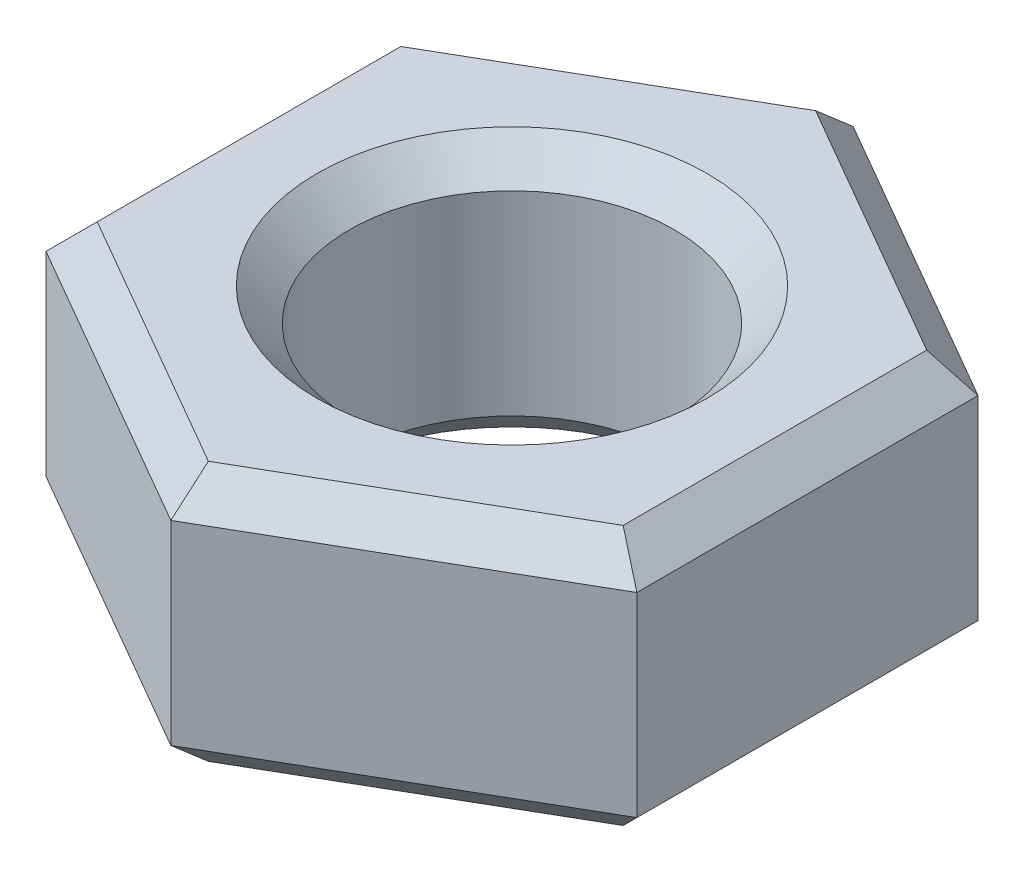
ISO-10303-21;
HEADER;
FILE_DESCRIPTION(('STEP AP214'),'2;1');
FILE_NAME('part.step','',(''),(''),'','','');
FILE_SCHEMA(('AUTOMOTIVE_DESIGN { 1 0 10303 214 1 1 1 1 }'));
ENDSEC;
DATA;
#1=APPLICATION_CONTEXT('core data for automotive mechanical design processes');
#2=APPLICATION_PROTOCOL_DEFINITION('international standard','automotive_design',2000,#1);
#3=PRODUCT_CONTEXT('',#1,'mechanical');
#4=PRODUCT('Part','Part','',(#3));
#5=PRODUCT_RELATED_PRODUCT_CATEGORY('part','',(#4));
#6=PRODUCT_DEFINITION_FORMATION('','',#4);
#7=PRODUCT_DEFINITION_CONTEXT('part definition',#1,'design');
#8=PRODUCT_DEFINITION('design','',#6,#7);
#9=PRODUCT_DEFINITION_SHAPE('','',#8);
#10=(LENGTH_UNIT() NAMED_UNIT(*) SI_UNIT(.MILLI.,.METRE.));
#11=(NAMED_UNIT(*) PLANE_ANGLE_UNIT() SI_UNIT($,.RADIAN.));
#12=(NAMED_UNIT(*) SI_UNIT($,.STERADIAN.) SOLID_ANGLE_UNIT());
#13=UNCERTAINTY_MEASURE_WITH_UNIT(LENGTH_MEASURE(1.E-05),#10,'distance_accuracy_value','');
#14=(GEOMETRIC_REPRESENTATION_CONTEXT(3) GLOBAL_UNCERTAINTY_ASSIGNED_CONTEXT((#13)) GLOBAL_UNIT_ASSIGNED_CONTEXT((#10,
#11,#12)) REPRESENTATION_CONTEXT('',''));
#15=CARTESIAN_POINT('',(0.,0.,0.));
#16=DIRECTION('',(0.,0.,1.));
#17=DIRECTION('',(1.,0.,0.));
#18=AXIS2_PLACEMENT_3D('',#15,#16,#17);
#19=CARTESIAN_POINT('',(0.,2.4,0.));
#20=DIRECTION('',(0.,1.,0.));
#21=DIRECTION('',(0.,0.,1.));
#22=AXIS2_PLACEMENT_3D('',#19,#20,#21);
#23=PLANE('',#22);
#24=CARTESIAN_POINT('',(0.,2.4,0.));
#25=DIRECTION('',(0.,1.,0.));
#26=DIRECTION('',(0.,0.,1.));
#27=AXIS2_PLACEMENT_3D('',#24,#25,#26);
#28=CIRCLE('',#27,1.8);
#29=CARTESIAN_POINT('',(0.,2.4,1.8));
#30=VERTEX_POINT('',#29);
#31=EDGE_CURVE('E158',#30,#30,#28,.F.);
#32=ORIENTED_EDGE('',*,*,#31,.T.);
#33=EDGE_LOOP('',(#32));
#34=FACE_BOUND('',#33,.T.);
#35=DIRECTION('',(0.866025403784439,0.,-0.5));
#36=VECTOR('',#35,1.);
#37=CARTESIAN_POINT('',(2.57798002192098,2.4,1.31519237886467));
#38=LINE('',#37,#36);
#39=CARTESIAN_POINT('',(0.,2.4,2.80358983848622));
#40=VERTEX_POINT('',#39);
#41=CARTESIAN_POINT('',(2.42798002192098,2.4,1.40179491924311));
#42=VERTEX_POINT('',#41);
#43=EDGE_CURVE('E156',#40,#42,#38,.T.);
#44=ORIENTED_EDGE('',*,*,#43,.T.);
#45=DIRECTION('',(0.,0.,-1.));
#46=VECTOR('',#45,1.);
#47=CARTESIAN_POINT('',(2.42798002192098,2.4,-1.575));
#48=LINE('',#47,#46);
#49=CARTESIAN_POINT('',(2.42798002192098,2.4,-1.40179491924311));
#50=VERTEX_POINT('',#49);
#51=EDGE_CURVE('E138',#42,#50,#48,.T.);
#52=ORIENTED_EDGE('',*,*,#51,.T.);
#53=DIRECTION('',(-0.866025403784439,0.,-0.5));
#54=VECTOR('',#53,1.);
#55=CARTESIAN_POINT('',(-0.150000000000001,2.4,-2.89019237886467));
#56=LINE('',#55,#54);
#57=CARTESIAN_POINT('',(0.,2.4,-2.80358983848622));
#58=VERTEX_POINT('',#57);
#59=EDGE_CURVE('E146',#50,#58,#56,.T.);
#60=ORIENTED_EDGE('',*,*,#59,.T.);
#61=DIRECTION('',(-0.866025403784439,0.,0.5));
#62=VECTOR('',#61,1.);
#63=CARTESIAN_POINT('',(-2.57798002192098,2.4,-1.31519237886467));
#64=LINE('',#63,#62);
#65=CARTESIAN_POINT('',(-2.42798002192098,2.4,-1.40179491924311));
#66=VERTEX_POINT('',#65);
#67=EDGE_CURVE('E152',#58,#66,#64,.T.);
#68=ORIENTED_EDGE('',*,*,#67,.T.);
#69=DIRECTION('',(0.,0.,1.));
#70=VECTOR('',#69,1.);
#71=CARTESIAN_POINT('',(-2.42798002192098,2.4,1.575));
#72=LINE('',#71,#70);
#73=CARTESIAN_POINT('',(-2.42798002192098,2.4,1.40179491924311));
#74=VERTEX_POINT('',#73);
#75=EDGE_CURVE('E271',#66,#74,#72,.T.);
#76=ORIENTED_EDGE('',*,*,#75,.T.);
#77=DIRECTION('',(0.866025403784439,0.,0.5));
#78=VECTOR('',#77,1.);
#79=CARTESIAN_POINT('',(0.15,2.4,2.89019237886467));
#80=LINE('',#79,#78);
#81=EDGE_CURVE('E163',#74,#40,#80,.T.);
#82=ORIENTED_EDGE('',*,*,#81,.T.);
#83=EDGE_LOOP('',(#44,#52,#60,#68,#76,#82));
#84=FACE_BOUND('',#83,.T.);
#85=ADVANCED_FACE('F40',(#34,#84),#23,.T.);
#86=CARTESIAN_POINT('',(0.,0.,0.));
#87=DIRECTION('',(0.,1.,0.));
#88=DIRECTION('',(0.,0.,1.));
#89=AXIS2_PLACEMENT_3D('',#86,#87,#88);
#90=PLANE('',#89);
#91=CARTESIAN_POINT('',(0.,0.,0.));
#92=DIRECTION('',(0.,1.,0.));
#93=DIRECTION('',(0.,0.,1.));
#94=AXIS2_PLACEMENT_3D('',#91,#92,#93);
#95=CIRCLE('',#94,1.8);
#96=CARTESIAN_POINT('',(0.,0.,1.8));
#97=VERTEX_POINT('',#96);
#98=EDGE_CURVE('E11',#97,#97,#95,.T.);
#99=ORIENTED_EDGE('',*,*,#98,.T.);
#100=EDGE_LOOP('',(#99));
#101=FACE_BOUND('',#100,.T.);
#102=DIRECTION('',(0.,0.,-1.));
#103=VECTOR('',#102,1.);
#104=CARTESIAN_POINT('',(-2.42798002192098,0.,0.));
#105=LINE('',#104,#103);
#106=CARTESIAN_POINT('',(-2.42798002192098,0.,1.40179491924311));
#107=VERTEX_POINT('',#106);
#108=CARTESIAN_POINT('',(-2.42798002192098,0.,-1.40179491924311));
#109=VERTEX_POINT('',#108);
#110=EDGE_CURVE('E59',#107,#109,#105,.T.);
#111=ORIENTED_EDGE('',*,*,#110,.T.);
#112=DIRECTION('',(0.866025403784439,0.,-0.5));
#113=VECTOR('',#112,1.);
#114=CARTESIAN_POINT('',(-1.21399001096049,0.,-2.10269237886467));
#115=LINE('',#114,#113);
#116=CARTESIAN_POINT('',(0.,0.,-2.80358983848622));
#117=VERTEX_POINT('',#116);
#118=EDGE_CURVE('E51',#109,#117,#115,.T.);
#119=ORIENTED_EDGE('',*,*,#118,.T.);
#120=DIRECTION('',(0.866025403784439,0.,0.5));
#121=VECTOR('',#120,1.);
#122=CARTESIAN_POINT('',(1.21399001096049,0.,-2.10269237886467));
#123=LINE('',#122,#121);
#124=CARTESIAN_POINT('',(2.42798002192098,0.,-1.40179491924311));
#125=VERTEX_POINT('',#124);
#126=EDGE_CURVE('E191',#117,#125,#123,.T.);
#127=ORIENTED_EDGE('',*,*,#126,.T.);
#128=DIRECTION('',(0.,0.,1.));
#129=VECTOR('',#128,1.);
#130=CARTESIAN_POINT('',(2.42798002192098,0.,0.));
#131=LINE('',#130,#129);
#132=CARTESIAN_POINT('',(2.42798002192098,0.,1.40179491924311));
#133=VERTEX_POINT('',#132);
#134=EDGE_CURVE('E193',#125,#133,#131,.T.);
#135=ORIENTED_EDGE('',*,*,#134,.T.);
#136=DIRECTION('',(-0.866025403784439,0.,0.5));
#137=VECTOR('',#136,1.);
#138=CARTESIAN_POINT('',(1.21399001096049,0.,2.10269237886467));
#139=LINE('',#138,#137);
#140=CARTESIAN_POINT('',(0.,0.,2.80358983848622));
#141=VERTEX_POINT('',#140);
#142=EDGE_CURVE('E196',#133,#141,#139,.T.);
#143=ORIENTED_EDGE('',*,*,#142,.T.);
#144=DIRECTION('',(-0.866025403784439,0.,-0.5));
#145=VECTOR('',#144,1.);
#146=CARTESIAN_POINT('',(-1.21399001096049,0.,2.10269237886467));
#147=LINE('',#146,#145);
#148=EDGE_CURVE('E64',#141,#107,#147,.T.);
#149=ORIENTED_EDGE('',*,*,#148,.T.);
#150=EDGE_LOOP('',(#111,#119,#127,#135,#143,#149));
#151=FACE_BOUND('',#150,.T.);
#152=ADVANCED_FACE('F239',(#101,#151),#90,.F.);
#153=CARTESIAN_POINT('',(2.72798002192098,2.4,-1.575));
#154=DIRECTION('',(-0.5,0.,0.866025403784439));
#155=DIRECTION('',(0.866025403784439,0.,0.5));
#156=AXIS2_PLACEMENT_3D('',#153,#154,#155);
#157=PLANE('',#156);
#158=DIRECTION('',(0.,-1.,0.));
#159=VECTOR('',#158,1.);
#160=CARTESIAN_POINT('',(0.,2.4,-3.15));
#161=LINE('',#160,#159);
#162=CARTESIAN_POINT('',(0.,2.1,-3.15));
#163=VERTEX_POINT('',#162);
#164=CARTESIAN_POINT('',(0.,0.3,-3.15));
#165=VERTEX_POINT('',#164);
#166=EDGE_CURVE('E251',#163,#165,#161,.T.);
#167=ORIENTED_EDGE('',*,*,#166,.F.);
#168=DIRECTION('',(0.866025403784439,0.,0.5));
#169=VECTOR('',#168,1.);
#170=CARTESIAN_POINT('',(2.72798002192098,2.1,-1.575));
#171=LINE('',#170,#169);
#172=CARTESIAN_POINT('',(2.72798002192098,2.1,-1.575));
#173=VERTEX_POINT('',#172);
#174=EDGE_CURVE('E189',#163,#173,#171,.T.);
#175=ORIENTED_EDGE('',*,*,#174,.T.);
#176=DIRECTION('',(0.,-1.,0.));
#177=VECTOR('',#176,1.);
#178=CARTESIAN_POINT('',(2.72798002192098,2.4,-1.575));
#179=LINE('',#178,#177);
#180=CARTESIAN_POINT('',(2.72798002192098,0.3,-1.575));
#181=VERTEX_POINT('',#180);
#182=EDGE_CURVE('E213',#173,#181,#179,.T.);
#183=ORIENTED_EDGE('',*,*,#182,.T.);
#184=DIRECTION('',(-0.866025403784439,0.,-0.5));
#185=VECTOR('',#184,1.);
#186=CARTESIAN_POINT('',(2.72798002192098,0.3,-1.575));
#187=LINE('',#186,#185);
#188=EDGE_CURVE('E187',#181,#165,#187,.T.);
#189=ORIENTED_EDGE('',*,*,#188,.T.);
#190=EDGE_LOOP('',(#167,#175,#183,#189));
#191=FACE_BOUND('',#190,.T.);
#192=ADVANCED_FACE('F250',(#191),#157,.F.);
#193=CARTESIAN_POINT('',(0.,2.4,-3.15));
#194=DIRECTION('',(0.5,0.,0.866025403784439));
#195=DIRECTION('',(0.866025403784439,0.,-0.5));
#196=AXIS2_PLACEMENT_3D('',#193,#194,#195);
#197=PLANE('',#196);
#198=DIRECTION('',(0.,-1.,0.));
#199=VECTOR('',#198,1.);
#200=CARTESIAN_POINT('',(-2.72798002192098,2.4,-1.575));
#201=LINE('',#200,#199);
#202=CARTESIAN_POINT('',(-2.72798002192098,2.1,-1.575));
#203=VERTEX_POINT('',#202);
#204=CARTESIAN_POINT('',(-2.72798002192098,0.3,-1.575));
#205=VERTEX_POINT('',#204);
#206=EDGE_CURVE('E259',#203,#205,#201,.T.);
#207=ORIENTED_EDGE('',*,*,#206,.F.);
#208=DIRECTION('',(0.866025403784439,0.,-0.5));
#209=VECTOR('',#208,1.);
#210=CARTESIAN_POINT('',(0.,2.1,-3.15));
#211=LINE('',#210,#209);
#212=EDGE_CURVE('E185',#203,#163,#211,.T.);
#213=ORIENTED_EDGE('',*,*,#212,.T.);
#214=ORIENTED_EDGE('',*,*,#166,.T.);
#215=DIRECTION('',(-0.866025403784439,0.,0.5));
#216=VECTOR('',#215,1.);
#217=CARTESIAN_POINT('',(0.,0.3,-3.15));
#218=LINE('',#217,#216);
#219=EDGE_CURVE('E181',#165,#205,#218,.T.);
#220=ORIENTED_EDGE('',*,*,#219,.T.);
#221=EDGE_LOOP('',(#207,#213,#214,#220));
#222=FACE_BOUND('',#221,.T.);
#223=ADVANCED_FACE('F255',(#222),#197,.F.);
#224=CARTESIAN_POINT('',(-2.72798002192098,2.4,-1.575));
#225=DIRECTION('',(1.,0.,0.));
#226=DIRECTION('',(0.,0.,-1.));
#227=AXIS2_PLACEMENT_3D('',#224,#225,#226);
#228=PLANE('',#227);
#229=DIRECTION('',(0.,-1.,0.));
#230=VECTOR('',#229,1.);
#231=CARTESIAN_POINT('',(-2.72798002192098,2.4,1.575));
#232=LINE('',#231,#230);
#233=CARTESIAN_POINT('',(-2.72798002192098,2.1,1.575));
#234=VERTEX_POINT('',#233);
#235=CARTESIAN_POINT('',(-2.72798002192098,0.3,1.575));
#236=VERTEX_POINT('',#235);
#237=EDGE_CURVE('E264',#234,#236,#232,.T.);
#238=ORIENTED_EDGE('',*,*,#237,.F.);
#239=DIRECTION('',(0.,0.,-1.));
#240=VECTOR('',#239,1.);
#241=CARTESIAN_POINT('',(-2.72798002192098,2.1,-1.575));
#242=LINE('',#241,#240);
#243=EDGE_CURVE('E179',#234,#203,#242,.T.);
#244=ORIENTED_EDGE('',*,*,#243,.T.);
#245=ORIENTED_EDGE('',*,*,#206,.T.);
#246=DIRECTION('',(0.,0.,1.));
#247=VECTOR('',#246,1.);
#248=CARTESIAN_POINT('',(-2.72798002192098,0.3,-1.575));
#249=LINE('',#248,#247);
#250=EDGE_CURVE('E177',#205,#236,#249,.T.);
#251=ORIENTED_EDGE('',*,*,#250,.T.);
#252=EDGE_LOOP('',(#238,#244,#245,#251));
#253=FACE_BOUND('',#252,.T.);
#254=ADVANCED_FACE('F333',(#253),#228,.F.);
#255=CARTESIAN_POINT('',(-2.72798002192098,2.4,1.575));
#256=DIRECTION('',(0.5,0.,-0.866025403784439));
#257=DIRECTION('',(-0.866025403784439,0.,-0.5));
#258=AXIS2_PLACEMENT_3D('',#255,#256,#257);
#259=PLANE('',#258);
#260=DIRECTION('',(0.,-1.,0.));
#261=VECTOR('',#260,1.);
#262=CARTESIAN_POINT('',(0.,2.4,3.15));
#263=LINE('',#262,#261);
#264=CARTESIAN_POINT('',(0.,2.1,3.15));
#265=VERTEX_POINT('',#264);
#266=CARTESIAN_POINT('',(0.,0.3,3.15));
#267=VERTEX_POINT('',#266);
#268=EDGE_CURVE('E291',#265,#267,#263,.T.);
#269=ORIENTED_EDGE('',*,*,#268,.F.);
#270=DIRECTION('',(-0.866025403784439,0.,-0.5));
#271=VECTOR('',#270,1.);
#272=CARTESIAN_POINT('',(-2.72798002192098,2.1,1.575));
#273=LINE('',#272,#271);
#274=EDGE_CURVE('E175',#265,#234,#273,.T.);
#275=ORIENTED_EDGE('',*,*,#274,.T.);
#276=ORIENTED_EDGE('',*,*,#237,.T.);
#277=DIRECTION('',(0.866025403784439,0.,0.5));
#278=VECTOR('',#277,1.);
#279=CARTESIAN_POINT('',(-2.72798002192098,0.3,1.575));
#280=LINE('',#279,#278);
#281=EDGE_CURVE('E173',#236,#267,#280,.T.);
#282=ORIENTED_EDGE('',*,*,#281,.T.);
#283=EDGE_LOOP('',(#269,#275,#276,#282));
#284=FACE_BOUND('',#283,.T.);
#285=ADVANCED_FACE('F298',(#284),#259,.F.);
#286=CARTESIAN_POINT('',(0.,2.4,3.15));
#287=DIRECTION('',(-0.5,0.,-0.866025403784439));
#288=DIRECTION('',(-0.866025403784439,0.,0.5));
#289=AXIS2_PLACEMENT_3D('',#286,#287,#288);
#290=PLANE('',#289);
#291=DIRECTION('',(0.,-1.,0.));
#292=VECTOR('',#291,1.);
#293=CARTESIAN_POINT('',(2.72798002192098,2.4,1.575));
#294=LINE('',#293,#292);
#295=CARTESIAN_POINT('',(2.72798002192098,2.1,1.575));
#296=VERTEX_POINT('',#295);
#297=CARTESIAN_POINT('',(2.72798002192098,0.3,1.575));
#298=VERTEX_POINT('',#297);
#299=EDGE_CURVE('E289',#296,#298,#294,.T.);
#300=ORIENTED_EDGE('',*,*,#299,.F.);
#301=DIRECTION('',(-0.866025403784439,0.,0.5));
#302=VECTOR('',#301,1.);
#303=CARTESIAN_POINT('',(0.,2.1,3.15));
#304=LINE('',#303,#302);
#305=EDGE_CURVE('E171',#296,#265,#304,.T.);
#306=ORIENTED_EDGE('',*,*,#305,.T.);
#307=ORIENTED_EDGE('',*,*,#268,.T.);
#308=DIRECTION('',(0.866025403784439,0.,-0.5));
#309=VECTOR('',#308,1.);
#310=CARTESIAN_POINT('',(0.,0.3,3.15));
#311=LINE('',#310,#309);
#312=EDGE_CURVE('E169',#267,#298,#311,.T.);
#313=ORIENTED_EDGE('',*,*,#312,.T.);
#314=EDGE_LOOP('',(#300,#306,#307,#313));
#315=FACE_BOUND('',#314,.T.);
#316=ADVANCED_FACE('F290',(#315),#290,.F.);
#317=CARTESIAN_POINT('',(2.72798002192098,2.4,1.575));
#318=DIRECTION('',(-1.,0.,0.));
#319=DIRECTION('',(0.,0.,1.));
#320=AXIS2_PLACEMENT_3D('',#317,#318,#319);
#321=PLANE('',#320);
#322=ORIENTED_EDGE('',*,*,#182,.F.);
#323=DIRECTION('',(0.,0.,1.));
#324=VECTOR('',#323,1.);
#325=CARTESIAN_POINT('',(2.72798002192098,2.1,1.575));
#326=LINE('',#325,#324);
#327=EDGE_CURVE('E140',#173,#296,#326,.T.);
#328=ORIENTED_EDGE('',*,*,#327,.T.);
#329=ORIENTED_EDGE('',*,*,#299,.T.);
#330=DIRECTION('',(0.,0.,-1.));
#331=VECTOR('',#330,1.);
#332=CARTESIAN_POINT('',(2.72798002192098,0.3,1.575));
#333=LINE('',#332,#331);
#334=EDGE_CURVE('E161',#298,#181,#333,.T.);
#335=ORIENTED_EDGE('',*,*,#334,.T.);
#336=EDGE_LOOP('',(#322,#328,#329,#335));
#337=FACE_BOUND('',#336,.T.);
#338=ADVANCED_FACE('F288',(#337),#321,.F.);
#339=CARTESIAN_POINT('',(0.,2.4,0.));
#340=DIRECTION('',(0.,-1.,0.));
#341=DIRECTION('',(0.,0.,-1.));
#342=AXIS2_PLACEMENT_3D('',#339,#340,#341);
#343=CYLINDRICAL_SURFACE('',#342,1.5);
#344=CARTESIAN_POINT('',(0.,2.1,0.));
#345=DIRECTION('',(0.,1.,0.));
#346=DIRECTION('',(0.,0.,1.));
#347=AXIS2_PLACEMENT_3D('',#344,#345,#346);
#348=CIRCLE('',#347,1.5);
#349=CARTESIAN_POINT('',(0.,2.1,1.5));
#350=VERTEX_POINT('',#349);
#351=EDGE_CURVE('E153',#350,#350,#348,.T.);
#352=ORIENTED_EDGE('',*,*,#351,.T.);
#353=EDGE_LOOP('',(#352));
#354=FACE_BOUND('',#353,.T.);
#355=CARTESIAN_POINT('',(0.,0.3,0.));
#356=DIRECTION('',(0.,1.,0.));
#357=DIRECTION('',(0.,0.,1.));
#358=AXIS2_PLACEMENT_3D('',#355,#356,#357);
#359=CIRCLE('',#358,1.5);
#360=CARTESIAN_POINT('',(0.,0.3,1.5));
#361=VERTEX_POINT('',#360);
#362=EDGE_CURVE('E258',#361,#361,#359,.F.);
#363=ORIENTED_EDGE('',*,*,#362,.T.);
#364=EDGE_LOOP('',(#363));
#365=FACE_BOUND('',#364,.T.);
#366=ADVANCED_FACE('F325',(#354,#365),#343,.F.);
#367=CARTESIAN_POINT('',(0.,2.1,0.));
#368=DIRECTION('',(0.,1.,0.));
#369=DIRECTION('',(0.,0.,1.));
#370=AXIS2_PLACEMENT_3D('',#367,#368,#369);
#371=CONICAL_SURFACE('',#370,1.5,0.785398163397447);
#372=ORIENTED_EDGE('',*,*,#31,.F.);
#373=EDGE_LOOP('',(#372));
#374=FACE_BOUND('',#373,.T.);
#375=ORIENTED_EDGE('',*,*,#351,.F.);
#376=EDGE_LOOP('',(#375));
#377=FACE_BOUND('',#376,.T.);
#378=ADVANCED_FACE('F341',(#374,#377),#371,.F.);
#379=CARTESIAN_POINT('',(-2.42798002192098,2.4,0.));
#380=DIRECTION('',(-0.707106781186548,0.707106781186547,0.));
#381=DIRECTION('',(0.,0.,-1.));
#382=AXIS2_PLACEMENT_3D('',#379,#380,#381);
#383=PLANE('',#382);
#384=DIRECTION('',(0.654653670707977,0.654653670707978,0.377964473009227));
#385=VECTOR('',#384,1.);
#386=CARTESIAN_POINT('',(-2.08112573307513,2.74685428884585,-1.20153850220838));
#387=LINE('',#386,#385);
#388=EDGE_CURVE('E207',#203,#66,#387,.T.);
#389=ORIENTED_EDGE('',*,*,#388,.F.);
#390=ORIENTED_EDGE('',*,*,#243,.F.);
#391=DIRECTION('',(0.654653670707977,0.654653670707978,-0.377964473009226));
#392=VECTOR('',#391,1.);
#393=CARTESIAN_POINT('',(-2.08112573307513,2.74685428884585,1.20153850220838));
#394=LINE('',#393,#392);
#395=EDGE_CURVE('E210',#74,#234,#394,.F.);
#396=ORIENTED_EDGE('',*,*,#395,.F.);
#397=ORIENTED_EDGE('',*,*,#75,.F.);
#398=EDGE_LOOP('',(#389,#390,#396,#397));
#399=FACE_BOUND('',#398,.T.);
#400=ADVANCED_FACE('F347',(#399),#383,.T.);
#401=CARTESIAN_POINT('',(-1.21399001096049,2.4,2.10269237886467));
#402=DIRECTION('',(-0.353553390593274,0.707106781186546,0.612372435695796));
#403=DIRECTION('',(-0.866025403784439,0.,-0.5));
#404=AXIS2_PLACEMENT_3D('',#401,#402,#403);
#405=PLANE('',#404);
#406=ORIENTED_EDGE('',*,*,#395,.T.);
#407=ORIENTED_EDGE('',*,*,#274,.F.);
#408=DIRECTION('',(0.,0.654653670707978,-0.755928946018453));
#409=VECTOR('',#408,1.);
#410=CARTESIAN_POINT('',(0.,2.74685428884586,2.40307700441676));
#411=LINE('',#410,#409);
#412=EDGE_CURVE('E204',#40,#265,#411,.F.);
#413=ORIENTED_EDGE('',*,*,#412,.F.);
#414=ORIENTED_EDGE('',*,*,#81,.F.);
#415=EDGE_LOOP('',(#406,#407,#413,#414));
#416=FACE_BOUND('',#415,.T.);
#417=ADVANCED_FACE('F278',(#416),#405,.T.);
#418=CARTESIAN_POINT('',(-1.21399001096049,2.4,-2.10269237886467));
#419=DIRECTION('',(-0.353553390593274,0.707106781186547,-0.612372435695795));
#420=DIRECTION('',(0.866025403784439,0.,-0.5));
#421=AXIS2_PLACEMENT_3D('',#418,#419,#420);
#422=PLANE('',#421);
#423=ORIENTED_EDGE('',*,*,#388,.T.);
#424=ORIENTED_EDGE('',*,*,#67,.F.);
#425=DIRECTION('',(0.,0.654653670707978,0.755928946018453));
#426=VECTOR('',#425,1.);
#427=CARTESIAN_POINT('',(0.,2.74685428884585,-2.40307700441676));
#428=LINE('',#427,#426);
#429=EDGE_CURVE('E149',#163,#58,#428,.T.);
#430=ORIENTED_EDGE('',*,*,#429,.F.);
#431=ORIENTED_EDGE('',*,*,#212,.F.);
#432=EDGE_LOOP('',(#423,#424,#430,#431));
#433=FACE_BOUND('',#432,.T.);
#434=ADVANCED_FACE('F367',(#433),#422,.T.);
#435=CARTESIAN_POINT('',(1.21399001096049,2.4,2.10269237886467));
#436=DIRECTION('',(0.353553390593274,0.707106781186547,0.612372435695795));
#437=DIRECTION('',(-0.866025403784439,0.,0.5));
#438=AXIS2_PLACEMENT_3D('',#435,#436,#437);
#439=PLANE('',#438);
#440=ORIENTED_EDGE('',*,*,#412,.T.);
#441=ORIENTED_EDGE('',*,*,#305,.F.);
#442=DIRECTION('',(-0.654653670707977,0.654653670707978,-0.377964473009227));
#443=VECTOR('',#442,1.);
#444=CARTESIAN_POINT('',(2.08112573307513,2.74685428884585,1.20153850220838));
#445=LINE('',#444,#443);
#446=EDGE_CURVE('E143',#42,#296,#445,.F.);
#447=ORIENTED_EDGE('',*,*,#446,.F.);
#448=ORIENTED_EDGE('',*,*,#43,.F.);
#449=EDGE_LOOP('',(#440,#441,#447,#448));
#450=FACE_BOUND('',#449,.T.);
#451=ADVANCED_FACE('F281',(#450),#439,.T.);
#452=CARTESIAN_POINT('',(1.21399001096049,2.4,-2.10269237886467));
#453=DIRECTION('',(0.353553390593274,0.707106781186546,-0.612372435695796));
#454=DIRECTION('',(0.866025403784439,0.,0.5));
#455=AXIS2_PLACEMENT_3D('',#452,#453,#454);
#456=PLANE('',#455);
#457=ORIENTED_EDGE('',*,*,#429,.T.);
#458=ORIENTED_EDGE('',*,*,#59,.F.);
#459=DIRECTION('',(0.654653670707977,-0.654653670707978,-0.377964473009226));
#460=VECTOR('',#459,1.);
#461=CARTESIAN_POINT('',(2.08112573307513,2.74685428884586,-1.20153850220838));
#462=LINE('',#461,#460);
#463=EDGE_CURVE('E134',#173,#50,#462,.F.);
#464=ORIENTED_EDGE('',*,*,#463,.F.);
#465=ORIENTED_EDGE('',*,*,#174,.F.);
#466=EDGE_LOOP('',(#457,#458,#464,#465));
#467=FACE_BOUND('',#466,.T.);
#468=ADVANCED_FACE('F147',(#467),#456,.T.);
#469=CARTESIAN_POINT('',(2.42798002192098,2.4,0.));
#470=DIRECTION('',(0.707106781186548,0.707106781186547,0.));
#471=DIRECTION('',(0.,0.,1.));
#472=AXIS2_PLACEMENT_3D('',#469,#470,#471);
#473=PLANE('',#472);
#474=ORIENTED_EDGE('',*,*,#446,.T.);
#475=ORIENTED_EDGE('',*,*,#327,.F.);
#476=ORIENTED_EDGE('',*,*,#463,.T.);
#477=ORIENTED_EDGE('',*,*,#51,.F.);
#478=EDGE_LOOP('',(#474,#475,#476,#477));
#479=FACE_BOUND('',#478,.T.);
#480=ADVANCED_FACE('F136',(#479),#473,.T.);
#481=CARTESIAN_POINT('',(0.,0.,0.));
#482=DIRECTION('',(0.,-1.,0.));
#483=DIRECTION('',(0.,0.,-1.));
#484=AXIS2_PLACEMENT_3D('',#481,#482,#483);
#485=CONICAL_SURFACE('',#484,1.8,0.785398163397447);
#486=ORIENTED_EDGE('',*,*,#362,.F.);
#487=EDGE_LOOP('',(#486));
#488=FACE_BOUND('',#487,.T.);
#489=ORIENTED_EDGE('',*,*,#98,.F.);
#490=EDGE_LOOP('',(#489));
#491=FACE_BOUND('',#490,.T.);
#492=ADVANCED_FACE('F356',(#488,#491),#485,.F.);
#493=CARTESIAN_POINT('',(0.,0.3,3.15));
#494=DIRECTION('',(-0.353553390593273,0.707106781186548,-0.612372435695794));
#495=DIRECTION('',(0.866025403784439,0.,-0.5));
#496=AXIS2_PLACEMENT_3D('',#493,#494,#495);
#497=PLANE('',#496);
#498=DIRECTION('',(0.,-0.654653670707976,-0.755928946018455));
#499=VECTOR('',#498,1.);
#500=CARTESIAN_POINT('',(0.,0.3,3.15));
#501=LINE('',#500,#499);
#502=EDGE_CURVE('E224',#141,#267,#501,.F.);
#503=ORIENTED_EDGE('',*,*,#502,.F.);
#504=ORIENTED_EDGE('',*,*,#142,.F.);
#505=DIRECTION('',(-0.654653670707978,-0.654653670707976,-0.377964473009227));
#506=VECTOR('',#505,1.);
#507=CARTESIAN_POINT('',(2.72798002192098,0.3,1.575));
#508=LINE('',#507,#506);
#509=EDGE_CURVE('E45',#298,#133,#508,.T.);
#510=ORIENTED_EDGE('',*,*,#509,.F.);
#511=ORIENTED_EDGE('',*,*,#312,.F.);
#512=EDGE_LOOP('',(#503,#504,#510,#511));
#513=FACE_BOUND('',#512,.T.);
#514=ADVANCED_FACE('F43',(#513),#497,.F.);
#515=CARTESIAN_POINT('',(2.72798002192098,0.3,1.575));
#516=DIRECTION('',(-0.707106781186546,0.707106781186549,0.));
#517=DIRECTION('',(0.,0.,-1.));
#518=AXIS2_PLACEMENT_3D('',#515,#516,#517);
#519=PLANE('',#518);
#520=ORIENTED_EDGE('',*,*,#509,.T.);
#521=ORIENTED_EDGE('',*,*,#134,.F.);
#522=DIRECTION('',(-0.654653670707978,-0.654653670707976,0.377964473009228));
#523=VECTOR('',#522,1.);
#524=CARTESIAN_POINT('',(2.72798002192098,0.3,-1.575));
#525=LINE('',#524,#523);
#526=EDGE_CURVE('E221',#181,#125,#525,.T.);
#527=ORIENTED_EDGE('',*,*,#526,.F.);
#528=ORIENTED_EDGE('',*,*,#334,.F.);
#529=EDGE_LOOP('',(#520,#521,#527,#528));
#530=FACE_BOUND('',#529,.T.);
#531=ADVANCED_FACE('F234',(#530),#519,.F.);
#532=CARTESIAN_POINT('',(-2.72798002192098,0.3,1.575));
#533=DIRECTION('',(0.353553390593273,0.707106781186549,-0.612372435695794));
#534=DIRECTION('',(0.866025403784439,0.,0.5));
#535=AXIS2_PLACEMENT_3D('',#532,#533,#534);
#536=PLANE('',#535);
#537=ORIENTED_EDGE('',*,*,#502,.T.);
#538=ORIENTED_EDGE('',*,*,#281,.F.);
#539=DIRECTION('',(0.654653670707978,-0.654653670707976,-0.377964473009228));
#540=VECTOR('',#539,1.);
#541=CARTESIAN_POINT('',(-2.72798002192098,0.3,1.575));
#542=LINE('',#541,#540);
#543=EDGE_CURVE('E218',#107,#236,#542,.F.);
#544=ORIENTED_EDGE('',*,*,#543,.F.);
#545=ORIENTED_EDGE('',*,*,#148,.F.);
#546=EDGE_LOOP('',(#537,#538,#544,#545));
#547=FACE_BOUND('',#546,.T.);
#548=ADVANCED_FACE('F301',(#547),#536,.F.);
#549=CARTESIAN_POINT('',(2.72798002192098,0.3,-1.575));
#550=DIRECTION('',(-0.353553390593273,0.707106781186549,0.612372435695794));
#551=DIRECTION('',(-0.866025403784439,0.,-0.5));
#552=AXIS2_PLACEMENT_3D('',#549,#550,#551);
#553=PLANE('',#552);
#554=ORIENTED_EDGE('',*,*,#526,.T.);
#555=ORIENTED_EDGE('',*,*,#126,.F.);
#556=DIRECTION('',(0.,0.654653670707976,-0.755928946018455));
#557=VECTOR('',#556,1.);
#558=CARTESIAN_POINT('',(0.,-0.479422863405993,-2.25));
#559=LINE('',#558,#557);
#560=EDGE_CURVE('E216',#165,#117,#559,.F.);
#561=ORIENTED_EDGE('',*,*,#560,.F.);
#562=ORIENTED_EDGE('',*,*,#188,.F.);
#563=EDGE_LOOP('',(#554,#555,#561,#562));
#564=FACE_BOUND('',#563,.T.);
#565=ADVANCED_FACE('F243',(#564),#553,.F.);
#566=CARTESIAN_POINT('',(-2.72798002192098,0.3,-1.575));
#567=DIRECTION('',(0.707106781186546,0.707106781186549,0.));
#568=DIRECTION('',(0.,0.,1.));
#569=AXIS2_PLACEMENT_3D('',#566,#567,#568);
#570=PLANE('',#569);
#571=ORIENTED_EDGE('',*,*,#543,.T.);
#572=ORIENTED_EDGE('',*,*,#250,.F.);
#573=DIRECTION('',(0.654653670707979,-0.654653670707976,0.377964473009226));
#574=VECTOR('',#573,1.);
#575=CARTESIAN_POINT('',(-2.72798002192098,0.3,-1.575));
#576=LINE('',#575,#574);
#577=EDGE_CURVE('E214',#109,#205,#576,.F.);
#578=ORIENTED_EDGE('',*,*,#577,.F.);
#579=ORIENTED_EDGE('',*,*,#110,.F.);
#580=EDGE_LOOP('',(#571,#572,#578,#579));
#581=FACE_BOUND('',#580,.T.);
#582=ADVANCED_FACE('F304',(#581),#570,.F.);
#583=CARTESIAN_POINT('',(0.,0.3,-3.15));
#584=DIRECTION('',(0.353553390593273,0.707106781186548,0.612372435695794));
#585=DIRECTION('',(-0.866025403784439,0.,0.5));
#586=AXIS2_PLACEMENT_3D('',#583,#584,#585);
#587=PLANE('',#586);
#588=ORIENTED_EDGE('',*,*,#560,.T.);
#589=ORIENTED_EDGE('',*,*,#118,.F.);
#590=ORIENTED_EDGE('',*,*,#577,.T.);
#591=ORIENTED_EDGE('',*,*,#219,.F.);
#592=EDGE_LOOP('',(#588,#589,#590,#591));
#593=FACE_BOUND('',#592,.T.);
#594=ADVANCED_FACE('F307',(#593),#587,.F.);
#595=CLOSED_SHELL('',(#85,#152,#192,#223,#254,#285,#316,#338,#366,#378,#400,#417,#434,#451,#468,
#480,#492,#514,#531,#548,#565,#582,#594));
#596=MANIFOLD_SOLID_BREP('B2',#595);
#597=ADVANCED_BREP_SHAPE_REPRESENTATION('',(#18,#596),#14);
#598=SHAPE_DEFINITION_REPRESENTATION(#9,#597);
ENDSEC;
END-ISO-10303-21;
